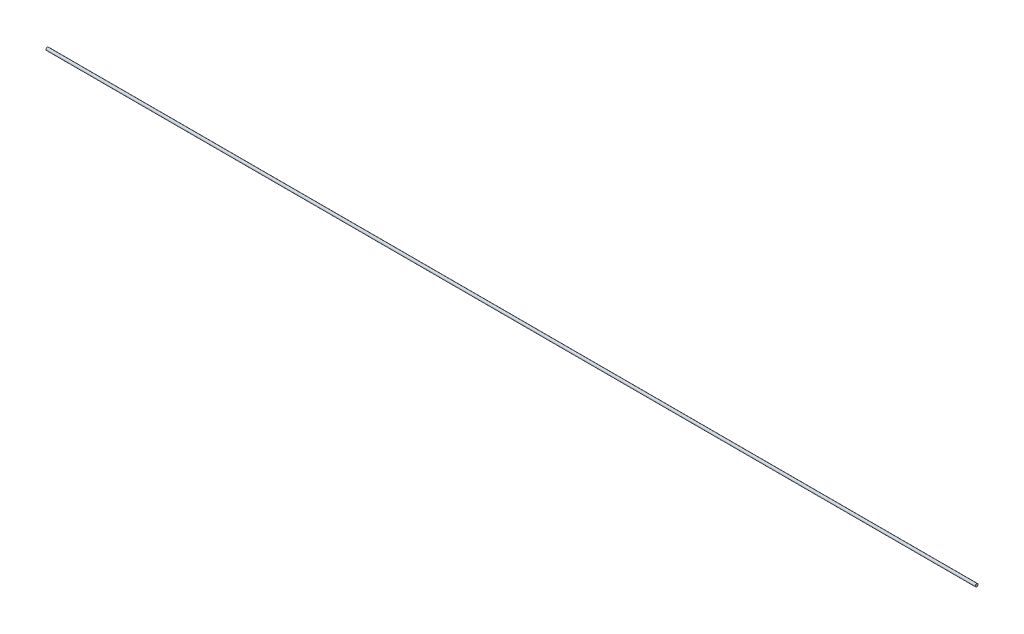
ISO-10303-21;
HEADER;
FILE_DESCRIPTION(('STEP AP214'),'2;1');
FILE_NAME('part.step','',(''),(''),'','','');
FILE_SCHEMA(('AUTOMOTIVE_DESIGN { 1 0 10303 214 1 1 1 1 }'));
ENDSEC;
DATA;
#1=APPLICATION_CONTEXT('core data for automotive mechanical design processes');
#2=APPLICATION_PROTOCOL_DEFINITION('international standard','automotive_design',2000,#1);
#3=PRODUCT_CONTEXT('',#1,'mechanical');
#4=PRODUCT('Part','Part','',(#3));
#5=PRODUCT_RELATED_PRODUCT_CATEGORY('part','',(#4));
#6=PRODUCT_DEFINITION_FORMATION('','',#4);
#7=PRODUCT_DEFINITION_CONTEXT('part definition',#1,'design');
#8=PRODUCT_DEFINITION('design','',#6,#7);
#9=PRODUCT_DEFINITION_SHAPE('','',#8);
#10=(LENGTH_UNIT() NAMED_UNIT(*) SI_UNIT(.MILLI.,.METRE.));
#11=(NAMED_UNIT(*) PLANE_ANGLE_UNIT() SI_UNIT($,.RADIAN.));
#12=(NAMED_UNIT(*) SI_UNIT($,.STERADIAN.) SOLID_ANGLE_UNIT());
#13=UNCERTAINTY_MEASURE_WITH_UNIT(LENGTH_MEASURE(1.E-05),#10,'distance_accuracy_value','');
#14=(GEOMETRIC_REPRESENTATION_CONTEXT(3) GLOBAL_UNCERTAINTY_ASSIGNED_CONTEXT((#13)) GLOBAL_UNIT_ASSIGNED_CONTEXT((#10,
#11,#12)) REPRESENTATION_CONTEXT('',''));
#15=CARTESIAN_POINT('',(0.,0.,0.));
#16=DIRECTION('',(0.,0.,1.));
#17=DIRECTION('',(1.,0.,0.));
#18=AXIS2_PLACEMENT_3D('',#15,#16,#17);
#19=CARTESIAN_POINT('',(12.,1.19,0.));
#20=DIRECTION('',(1.,0.,0.));
#21=DIRECTION('',(0.,0.,-1.));
#22=AXIS2_PLACEMENT_3D('',#19,#20,#21);
#23=PLANE('',#22);
#24=CARTESIAN_POINT('',(12.,0.,0.));
#25=DIRECTION('',(-1.,0.,0.));
#26=DIRECTION('',(0.,0.,1.));
#27=AXIS2_PLACEMENT_3D('',#24,#25,#26);
#28=CIRCLE('',#27,1.19);
#29=CARTESIAN_POINT('',(12.,0.,1.19));
#30=VERTEX_POINT('',#29);
#31=EDGE_CURVE('E44',#30,#30,#28,.T.);
#32=ORIENTED_EDGE('',*,*,#31,.T.);
#33=EDGE_LOOP('',(#32));
#34=FACE_BOUND('',#33,.T.);
#35=ADVANCED_FACE('F39',(#34),#23,.F.);
#36=CARTESIAN_POINT('',(809.248142171426,0.,0.));
#37=DIRECTION('',(-1.,0.,0.));
#38=DIRECTION('',(0.,0.,1.));
#39=AXIS2_PLACEMENT_3D('',#36,#37,#38);
#40=PLANE('',#39);
#41=CARTESIAN_POINT('',(809.248142171426,0.,0.));
#42=DIRECTION('',(-1.,0.,0.));
#43=DIRECTION('',(0.,0.,1.));
#44=AXIS2_PLACEMENT_3D('',#41,#42,#43);
#45=CIRCLE('',#44,1.19);
#46=CARTESIAN_POINT('',(809.248142171426,0.,1.19));
#47=VERTEX_POINT('',#46);
#48=EDGE_CURVE('E10',#47,#47,#45,.T.);
#49=ORIENTED_EDGE('',*,*,#48,.F.);
#50=EDGE_LOOP('',(#49));
#51=FACE_BOUND('',#50,.T.);
#52=ADVANCED_FACE('F53',(#51),#40,.F.);
#53=CARTESIAN_POINT('',(-3000.,0.,0.));
#54=DIRECTION('',(-1.,0.,0.));
#55=DIRECTION('',(0.,0.,1.));
#56=AXIS2_PLACEMENT_3D('',#53,#54,#55);
#57=CYLINDRICAL_SURFACE('',#56,1.19);
#58=ORIENTED_EDGE('',*,*,#31,.F.);
#59=EDGE_LOOP('',(#58));
#60=FACE_BOUND('',#59,.T.);
#61=ORIENTED_EDGE('',*,*,#48,.T.);
#62=EDGE_LOOP('',(#61));
#63=FACE_BOUND('',#62,.T.);
#64=ADVANCED_FACE('F55',(#60,#63),#57,.T.);
#65=CLOSED_SHELL('',(#35,#52,#64));
#66=MANIFOLD_SOLID_BREP('B2',#65);
#67=ADVANCED_BREP_SHAPE_REPRESENTATION('',(#18,#66),#14);
#68=SHAPE_DEFINITION_REPRESENTATION(#9,#67);
ENDSEC;
END-ISO-10303-21;
